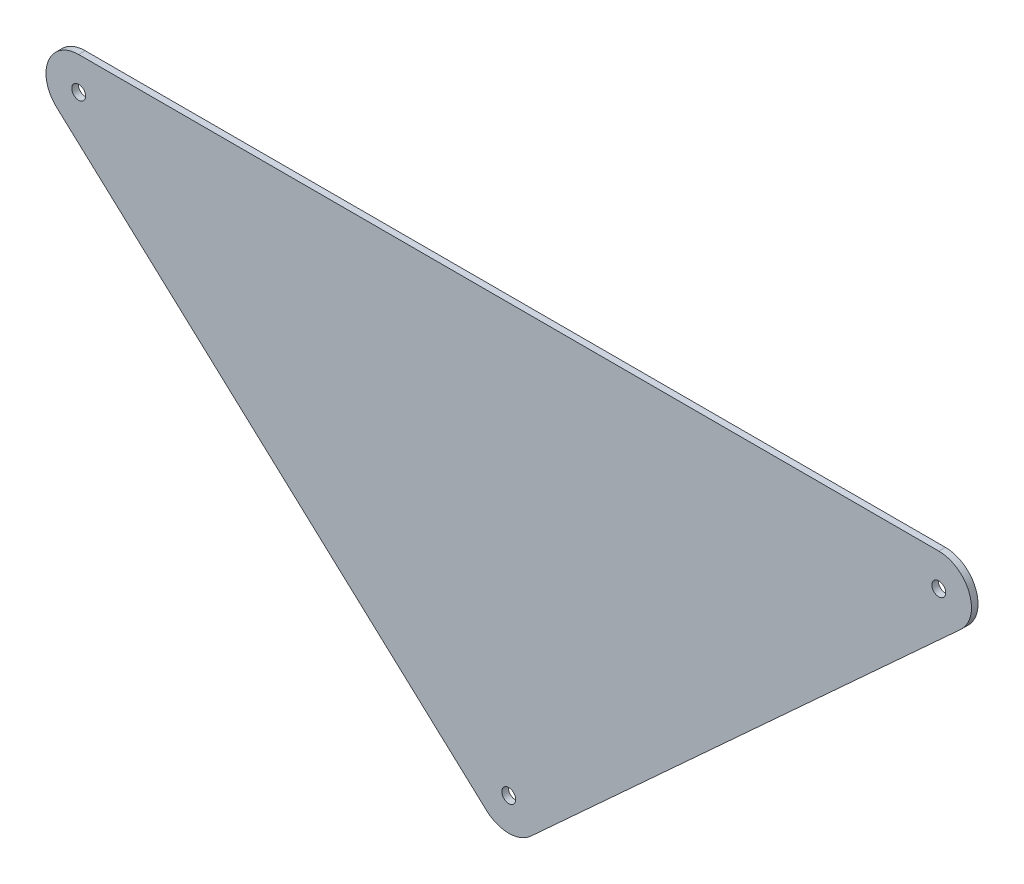
ISO-10303-21;
HEADER;
FILE_DESCRIPTION(('STEP AP214'),'2;1');
FILE_NAME('part.step','',(''),(''),'','','');
FILE_SCHEMA(('AUTOMOTIVE_DESIGN { 1 0 10303 214 1 1 1 1 }'));
ENDSEC;
DATA;
#1=APPLICATION_CONTEXT('core data for automotive mechanical design processes');
#2=APPLICATION_PROTOCOL_DEFINITION('international standard','automotive_design',2000,#1);
#3=PRODUCT_CONTEXT('',#1,'mechanical');
#4=PRODUCT('Part','Part','',(#3));
#5=PRODUCT_RELATED_PRODUCT_CATEGORY('part','',(#4));
#6=PRODUCT_DEFINITION_FORMATION('','',#4);
#7=PRODUCT_DEFINITION_CONTEXT('part definition',#1,'design');
#8=PRODUCT_DEFINITION('design','',#6,#7);
#9=PRODUCT_DEFINITION_SHAPE('','',#8);
#10=(LENGTH_UNIT() NAMED_UNIT(*) SI_UNIT(.MILLI.,.METRE.));
#11=(NAMED_UNIT(*) PLANE_ANGLE_UNIT() SI_UNIT($,.RADIAN.));
#12=(NAMED_UNIT(*) SI_UNIT($,.STERADIAN.) SOLID_ANGLE_UNIT());
#13=UNCERTAINTY_MEASURE_WITH_UNIT(LENGTH_MEASURE(1.E-05),#10,'distance_accuracy_value','');
#14=(GEOMETRIC_REPRESENTATION_CONTEXT(3) GLOBAL_UNCERTAINTY_ASSIGNED_CONTEXT((#13)) GLOBAL_UNIT_ASSIGNED_CONTEXT((#10,
#11,#12)) REPRESENTATION_CONTEXT('',''));
#15=CARTESIAN_POINT('',(0.,0.,0.));
#16=DIRECTION('',(0.,0.,1.));
#17=DIRECTION('',(1.,0.,0.));
#18=AXIS2_PLACEMENT_3D('',#15,#16,#17);
#19=CARTESIAN_POINT('',(-52.6210313941985,22.,0.8));
#20=DIRECTION('',(0.,0.,1.));
#21=DIRECTION('',(1.,0.,0.));
#22=AXIS2_PLACEMENT_3D('',#19,#20,#21);
#23=PLANE('',#22);
#24=CARTESIAN_POINT('',(52.6210313941985,22.,0.8));
#25=DIRECTION('',(0.,0.,1.));
#26=DIRECTION('',(1.,0.,0.));
#27=AXIS2_PLACEMENT_3D('',#24,#25,#26);
#28=CIRCLE('',#27,0.85);
#29=CARTESIAN_POINT('',(53.4710313941984,22.,0.8));
#30=VERTEX_POINT('',#29);
#31=EDGE_CURVE('E186',#30,#30,#28,.T.);
#32=ORIENTED_EDGE('',*,*,#31,.F.);
#33=EDGE_LOOP('',(#32));
#34=FACE_BOUND('',#33,.T.);
#35=CARTESIAN_POINT('',(-52.6210313941985,22.,0.8));
#36=DIRECTION('',(0.,0.,1.));
#37=DIRECTION('',(1.,0.,0.));
#38=AXIS2_PLACEMENT_3D('',#35,#36,#37);
#39=CIRCLE('',#38,4.);
#40=CARTESIAN_POINT('',(-52.6210313941984,26.,0.8));
#41=VERTEX_POINT('',#40);
#42=CARTESIAN_POINT('',(-55.323392224661,19.0508906527595,0.8));
#43=VERTEX_POINT('',#42);
#44=EDGE_CURVE('E131',#41,#43,#39,.T.);
#45=ORIENTED_EDGE('',*,*,#44,.T.);
#46=DIRECTION('',(0.737277336810123,-0.675590207615661,0.));
#47=VECTOR('',#46,1.);
#48=CARTESIAN_POINT('',(-55.323392224661,19.0508906527595,0.8));
#49=LINE('',#48,#47);
#50=CARTESIAN_POINT('',(-2.70236083046265,-29.1674008226942,0.8));
#51=VERTEX_POINT('',#50);
#52=EDGE_CURVE('E89',#43,#51,#49,.T.);
#53=ORIENTED_EDGE('',*,*,#52,.T.);
#54=CARTESIAN_POINT('',(0.,-26.2182914754537,0.8));
#55=DIRECTION('',(0.,0.,1.));
#56=DIRECTION('',(1.,0.,0.));
#57=AXIS2_PLACEMENT_3D('',#54,#55,#56);
#58=CIRCLE('',#57,4.);
#59=CARTESIAN_POINT('',(2.70236083046265,-29.1674008226942,0.8));
#60=VERTEX_POINT('',#59);
#61=EDGE_CURVE('E102',#51,#60,#58,.T.);
#62=ORIENTED_EDGE('',*,*,#61,.T.);
#63=DIRECTION('',(0.737277336810123,0.675590207615661,0.));
#64=VECTOR('',#63,1.);
#65=CARTESIAN_POINT('',(2.70236083046265,-29.1674008226942,0.8));
#66=LINE('',#65,#64);
#67=CARTESIAN_POINT('',(55.3233922246611,19.0508906527595,0.8));
#68=VERTEX_POINT('',#67);
#69=EDGE_CURVE('E96',#60,#68,#66,.T.);
#70=ORIENTED_EDGE('',*,*,#69,.T.);
#71=CARTESIAN_POINT('',(52.6210313941985,22.,0.8));
#72=DIRECTION('',(0.,0.,1.));
#73=DIRECTION('',(1.,0.,0.));
#74=AXIS2_PLACEMENT_3D('',#71,#72,#73);
#75=CIRCLE('',#74,4.);
#76=CARTESIAN_POINT('',(52.6210313941984,26.,0.8));
#77=VERTEX_POINT('',#76);
#78=EDGE_CURVE('E100',#68,#77,#75,.T.);
#79=ORIENTED_EDGE('',*,*,#78,.T.);
#80=DIRECTION('',(-1.,0.,0.));
#81=VECTOR('',#80,1.);
#82=CARTESIAN_POINT('',(52.6210313941984,26.,0.8));
#83=LINE('',#82,#81);
#84=EDGE_CURVE('E52',#77,#41,#83,.T.);
#85=ORIENTED_EDGE('',*,*,#84,.T.);
#86=EDGE_LOOP('',(#45,#53,#62,#70,#79,#85));
#87=FACE_BOUND('',#86,.T.);
#88=CARTESIAN_POINT('',(-52.6210313941985,22.,0.8));
#89=DIRECTION('',(0.,0.,1.));
#90=DIRECTION('',(1.,0.,0.));
#91=AXIS2_PLACEMENT_3D('',#88,#89,#90);
#92=CIRCLE('',#91,0.85);
#93=CARTESIAN_POINT('',(-51.7710313941985,22.,0.8));
#94=VERTEX_POINT('',#93);
#95=EDGE_CURVE('E124',#94,#94,#92,.T.);
#96=ORIENTED_EDGE('',*,*,#95,.F.);
#97=EDGE_LOOP('',(#96));
#98=FACE_BOUND('',#97,.T.);
#99=CARTESIAN_POINT('',(0.,-26.2182914754537,0.8));
#100=DIRECTION('',(0.,0.,1.));
#101=DIRECTION('',(1.,0.,0.));
#102=AXIS2_PLACEMENT_3D('',#99,#100,#101);
#103=CIRCLE('',#102,0.85);
#104=CARTESIAN_POINT('',(0.850000000000001,-26.2182914754537,0.8));
#105=VERTEX_POINT('',#104);
#106=EDGE_CURVE('E177',#105,#105,#103,.T.);
#107=ORIENTED_EDGE('',*,*,#106,.F.);
#108=EDGE_LOOP('',(#107));
#109=FACE_BOUND('',#108,.T.);
#110=ADVANCED_FACE('F35',(#34,#87,#98,#109),#23,.T.);
#111=CARTESIAN_POINT('',(-52.6210313941985,22.,0.));
#112=DIRECTION('',(0.,0.,1.));
#113=DIRECTION('',(1.,0.,0.));
#114=AXIS2_PLACEMENT_3D('',#111,#112,#113);
#115=PLANE('',#114);
#116=CARTESIAN_POINT('',(-52.6210313941985,22.,0.));
#117=DIRECTION('',(0.,0.,1.));
#118=DIRECTION('',(1.,0.,0.));
#119=AXIS2_PLACEMENT_3D('',#116,#117,#118);
#120=CIRCLE('',#119,4.);
#121=CARTESIAN_POINT('',(-52.6210313941984,26.,0.));
#122=VERTEX_POINT('',#121);
#123=CARTESIAN_POINT('',(-55.323392224661,19.0508906527595,0.));
#124=VERTEX_POINT('',#123);
#125=EDGE_CURVE('E120',#122,#124,#120,.T.);
#126=ORIENTED_EDGE('',*,*,#125,.F.);
#127=DIRECTION('',(-1.,0.,0.));
#128=VECTOR('',#127,1.);
#129=CARTESIAN_POINT('',(52.6210313941984,26.,0.));
#130=LINE('',#129,#128);
#131=CARTESIAN_POINT('',(52.6210313941984,26.,0.));
#132=VERTEX_POINT('',#131);
#133=EDGE_CURVE('E81',#132,#122,#130,.T.);
#134=ORIENTED_EDGE('',*,*,#133,.F.);
#135=CARTESIAN_POINT('',(52.6210313941985,22.,0.));
#136=DIRECTION('',(0.,0.,1.));
#137=DIRECTION('',(1.,0.,0.));
#138=AXIS2_PLACEMENT_3D('',#135,#136,#137);
#139=CIRCLE('',#138,4.);
#140=CARTESIAN_POINT('',(55.3233922246611,19.0508906527595,0.));
#141=VERTEX_POINT('',#140);
#142=EDGE_CURVE('E75',#141,#132,#139,.T.);
#143=ORIENTED_EDGE('',*,*,#142,.F.);
#144=DIRECTION('',(0.737277336810123,0.675590207615661,0.));
#145=VECTOR('',#144,1.);
#146=CARTESIAN_POINT('',(2.70236083046265,-29.1674008226942,0.));
#147=LINE('',#146,#145);
#148=CARTESIAN_POINT('',(2.70236083046265,-29.1674008226942,0.));
#149=VERTEX_POINT('',#148);
#150=EDGE_CURVE('E110',#149,#141,#147,.T.);
#151=ORIENTED_EDGE('',*,*,#150,.F.);
#152=CARTESIAN_POINT('',(0.,-26.2182914754537,0.));
#153=DIRECTION('',(0.,0.,1.));
#154=DIRECTION('',(1.,0.,0.));
#155=AXIS2_PLACEMENT_3D('',#152,#153,#154);
#156=CIRCLE('',#155,4.);
#157=CARTESIAN_POINT('',(-2.70236083046265,-29.1674008226942,0.));
#158=VERTEX_POINT('',#157);
#159=EDGE_CURVE('E126',#158,#149,#156,.T.);
#160=ORIENTED_EDGE('',*,*,#159,.F.);
#161=DIRECTION('',(0.737277336810123,-0.675590207615661,0.));
#162=VECTOR('',#161,1.);
#163=CARTESIAN_POINT('',(-55.323392224661,19.0508906527595,0.));
#164=LINE('',#163,#162);
#165=EDGE_CURVE('E123',#124,#158,#164,.T.);
#166=ORIENTED_EDGE('',*,*,#165,.F.);
#167=EDGE_LOOP('',(#126,#134,#143,#151,#160,#166));
#168=FACE_BOUND('',#167,.T.);
#169=CARTESIAN_POINT('',(-52.6210313941985,22.,0.));
#170=DIRECTION('',(0.,0.,1.));
#171=DIRECTION('',(1.,0.,0.));
#172=AXIS2_PLACEMENT_3D('',#169,#170,#171);
#173=CIRCLE('',#172,0.85);
#174=CARTESIAN_POINT('',(-51.7710313941985,22.,0.));
#175=VERTEX_POINT('',#174);
#176=EDGE_CURVE('E189',#175,#175,#173,.T.);
#177=ORIENTED_EDGE('',*,*,#176,.T.);
#178=EDGE_LOOP('',(#177));
#179=FACE_BOUND('',#178,.T.);
#180=CARTESIAN_POINT('',(52.6210313941985,22.,0.));
#181=DIRECTION('',(0.,0.,1.));
#182=DIRECTION('',(1.,0.,0.));
#183=AXIS2_PLACEMENT_3D('',#180,#181,#182);
#184=CIRCLE('',#183,0.85);
#185=CARTESIAN_POINT('',(53.4710313941984,22.,0.));
#186=VERTEX_POINT('',#185);
#187=EDGE_CURVE('E183',#186,#186,#184,.T.);
#188=ORIENTED_EDGE('',*,*,#187,.T.);
#189=EDGE_LOOP('',(#188));
#190=FACE_BOUND('',#189,.T.);
#191=CARTESIAN_POINT('',(0.,-26.2182914754537,0.));
#192=DIRECTION('',(0.,0.,1.));
#193=DIRECTION('',(1.,0.,0.));
#194=AXIS2_PLACEMENT_3D('',#191,#192,#193);
#195=CIRCLE('',#194,0.85);
#196=CARTESIAN_POINT('',(0.850000000000001,-26.2182914754537,0.));
#197=VERTEX_POINT('',#196);
#198=EDGE_CURVE('E180',#197,#197,#195,.T.);
#199=ORIENTED_EDGE('',*,*,#198,.T.);
#200=EDGE_LOOP('',(#199));
#201=FACE_BOUND('',#200,.T.);
#202=ADVANCED_FACE('F140',(#168,#179,#190,#201),#115,.F.);
#203=CARTESIAN_POINT('',(-52.6210313941985,22.,0.8));
#204=DIRECTION('',(0.,0.,-1.));
#205=DIRECTION('',(-1.,0.,0.));
#206=AXIS2_PLACEMENT_3D('',#203,#204,#205);
#207=CYLINDRICAL_SURFACE('',#206,4.);
#208=ORIENTED_EDGE('',*,*,#125,.T.);
#209=DIRECTION('',(0.,0.,-1.));
#210=VECTOR('',#209,1.);
#211=CARTESIAN_POINT('',(-55.323392224661,19.0508906527595,0.8));
#212=LINE('',#211,#210);
#213=EDGE_CURVE('E11',#43,#124,#212,.T.);
#214=ORIENTED_EDGE('',*,*,#213,.F.);
#215=ORIENTED_EDGE('',*,*,#44,.F.);
#216=DIRECTION('',(0.,0.,-1.));
#217=VECTOR('',#216,1.);
#218=CARTESIAN_POINT('',(-52.6210313941984,26.,0.8));
#219=LINE('',#218,#217);
#220=EDGE_CURVE('E116',#41,#122,#219,.T.);
#221=ORIENTED_EDGE('',*,*,#220,.T.);
#222=EDGE_LOOP('',(#208,#214,#215,#221));
#223=FACE_BOUND('',#222,.T.);
#224=ADVANCED_FACE('F37',(#223),#207,.T.);
#225=CARTESIAN_POINT('',(-55.323392224661,19.0508906527595,0.8));
#226=DIRECTION('',(0.675590207615661,0.737277336810123,0.));
#227=DIRECTION('',(-0.737277336810123,0.675590207615661,0.));
#228=AXIS2_PLACEMENT_3D('',#225,#226,#227);
#229=PLANE('',#228);
#230=ORIENTED_EDGE('',*,*,#165,.T.);
#231=DIRECTION('',(0.,0.,-1.));
#232=VECTOR('',#231,1.);
#233=CARTESIAN_POINT('',(-2.70236083046265,-29.1674008226942,0.8));
#234=LINE('',#233,#232);
#235=EDGE_CURVE('E44',#51,#158,#234,.T.);
#236=ORIENTED_EDGE('',*,*,#235,.F.);
#237=ORIENTED_EDGE('',*,*,#52,.F.);
#238=ORIENTED_EDGE('',*,*,#213,.T.);
#239=EDGE_LOOP('',(#230,#236,#237,#238));
#240=FACE_BOUND('',#239,.T.);
#241=ADVANCED_FACE('F239',(#240),#229,.F.);
#242=CARTESIAN_POINT('',(0.,-26.2182914754537,0.8));
#243=DIRECTION('',(0.,0.,-1.));
#244=DIRECTION('',(-1.,0.,0.));
#245=AXIS2_PLACEMENT_3D('',#242,#243,#244);
#246=CYLINDRICAL_SURFACE('',#245,4.);
#247=ORIENTED_EDGE('',*,*,#159,.T.);
#248=DIRECTION('',(0.,0.,-1.));
#249=VECTOR('',#248,1.);
#250=CARTESIAN_POINT('',(2.70236083046265,-29.1674008226942,0.8));
#251=LINE('',#250,#249);
#252=EDGE_CURVE('E111',#60,#149,#251,.T.);
#253=ORIENTED_EDGE('',*,*,#252,.F.);
#254=ORIENTED_EDGE('',*,*,#61,.F.);
#255=ORIENTED_EDGE('',*,*,#235,.T.);
#256=EDGE_LOOP('',(#247,#253,#254,#255));
#257=FACE_BOUND('',#256,.T.);
#258=ADVANCED_FACE('F137',(#257),#246,.T.);
#259=CARTESIAN_POINT('',(2.70236083046265,-29.1674008226942,0.8));
#260=DIRECTION('',(-0.675590207615661,0.737277336810123,0.));
#261=DIRECTION('',(-0.737277336810123,-0.675590207615661,0.));
#262=AXIS2_PLACEMENT_3D('',#259,#260,#261);
#263=PLANE('',#262);
#264=ORIENTED_EDGE('',*,*,#150,.T.);
#265=DIRECTION('',(0.,0.,-1.));
#266=VECTOR('',#265,1.);
#267=CARTESIAN_POINT('',(55.3233922246611,19.0508906527595,0.8));
#268=LINE('',#267,#266);
#269=EDGE_CURVE('E107',#68,#141,#268,.T.);
#270=ORIENTED_EDGE('',*,*,#269,.F.);
#271=ORIENTED_EDGE('',*,*,#69,.F.);
#272=ORIENTED_EDGE('',*,*,#252,.T.);
#273=EDGE_LOOP('',(#264,#270,#271,#272));
#274=FACE_BOUND('',#273,.T.);
#275=ADVANCED_FACE('F108',(#274),#263,.F.);
#276=CARTESIAN_POINT('',(52.6210313941985,22.,0.8));
#277=DIRECTION('',(0.,0.,-1.));
#278=DIRECTION('',(-1.,0.,0.));
#279=AXIS2_PLACEMENT_3D('',#276,#277,#278);
#280=CYLINDRICAL_SURFACE('',#279,4.);
#281=ORIENTED_EDGE('',*,*,#142,.T.);
#282=DIRECTION('',(0.,0.,-1.));
#283=VECTOR('',#282,1.);
#284=CARTESIAN_POINT('',(52.6210313941984,26.,0.8));
#285=LINE('',#284,#283);
#286=EDGE_CURVE('E112',#77,#132,#285,.T.);
#287=ORIENTED_EDGE('',*,*,#286,.F.);
#288=ORIENTED_EDGE('',*,*,#78,.F.);
#289=ORIENTED_EDGE('',*,*,#269,.T.);
#290=EDGE_LOOP('',(#281,#287,#288,#289));
#291=FACE_BOUND('',#290,.T.);
#292=ADVANCED_FACE('F114',(#291),#280,.T.);
#293=CARTESIAN_POINT('',(52.6210313941984,26.,0.8));
#294=DIRECTION('',(0.,-1.,0.));
#295=DIRECTION('',(1.,0.,0.));
#296=AXIS2_PLACEMENT_3D('',#293,#294,#295);
#297=PLANE('',#296);
#298=ORIENTED_EDGE('',*,*,#133,.T.);
#299=ORIENTED_EDGE('',*,*,#220,.F.);
#300=ORIENTED_EDGE('',*,*,#84,.F.);
#301=ORIENTED_EDGE('',*,*,#286,.T.);
#302=EDGE_LOOP('',(#298,#299,#300,#301));
#303=FACE_BOUND('',#302,.T.);
#304=ADVANCED_FACE('F145',(#303),#297,.F.);
#305=CARTESIAN_POINT('',(-52.6210313941985,22.,0.8));
#306=DIRECTION('',(0.,0.,-1.));
#307=DIRECTION('',(-1.,0.,0.));
#308=AXIS2_PLACEMENT_3D('',#305,#306,#307);
#309=CYLINDRICAL_SURFACE('',#308,0.85);
#310=ORIENTED_EDGE('',*,*,#95,.T.);
#311=EDGE_LOOP('',(#310));
#312=FACE_BOUND('',#311,.T.);
#313=ORIENTED_EDGE('',*,*,#176,.F.);
#314=EDGE_LOOP('',(#313));
#315=FACE_BOUND('',#314,.T.);
#316=ADVANCED_FACE('F147',(#312,#315),#309,.F.);
#317=CARTESIAN_POINT('',(52.6210313941985,22.,0.8));
#318=DIRECTION('',(0.,0.,-1.));
#319=DIRECTION('',(-1.,0.,0.));
#320=AXIS2_PLACEMENT_3D('',#317,#318,#319);
#321=CYLINDRICAL_SURFACE('',#320,0.85);
#322=ORIENTED_EDGE('',*,*,#31,.T.);
#323=EDGE_LOOP('',(#322));
#324=FACE_BOUND('',#323,.T.);
#325=ORIENTED_EDGE('',*,*,#187,.F.);
#326=EDGE_LOOP('',(#325));
#327=FACE_BOUND('',#326,.T.);
#328=ADVANCED_FACE('F153',(#324,#327),#321,.F.);
#329=CARTESIAN_POINT('',(0.,-26.2182914754537,0.8));
#330=DIRECTION('',(0.,0.,-1.));
#331=DIRECTION('',(-1.,0.,0.));
#332=AXIS2_PLACEMENT_3D('',#329,#330,#331);
#333=CYLINDRICAL_SURFACE('',#332,0.85);
#334=ORIENTED_EDGE('',*,*,#106,.T.);
#335=EDGE_LOOP('',(#334));
#336=FACE_BOUND('',#335,.T.);
#337=ORIENTED_EDGE('',*,*,#198,.F.);
#338=EDGE_LOOP('',(#337));
#339=FACE_BOUND('',#338,.T.);
#340=ADVANCED_FACE('F168',(#336,#339),#333,.F.);
#341=CLOSED_SHELL('',(#110,#202,#224,#241,#258,#275,#292,#304,#316,#328,#340));
#342=MANIFOLD_SOLID_BREP('B2',#341);
#343=ADVANCED_BREP_SHAPE_REPRESENTATION('',(#18,#342),#14);
#344=SHAPE_DEFINITION_REPRESENTATION(#9,#343);
ENDSEC;
END-ISO-10303-21;
